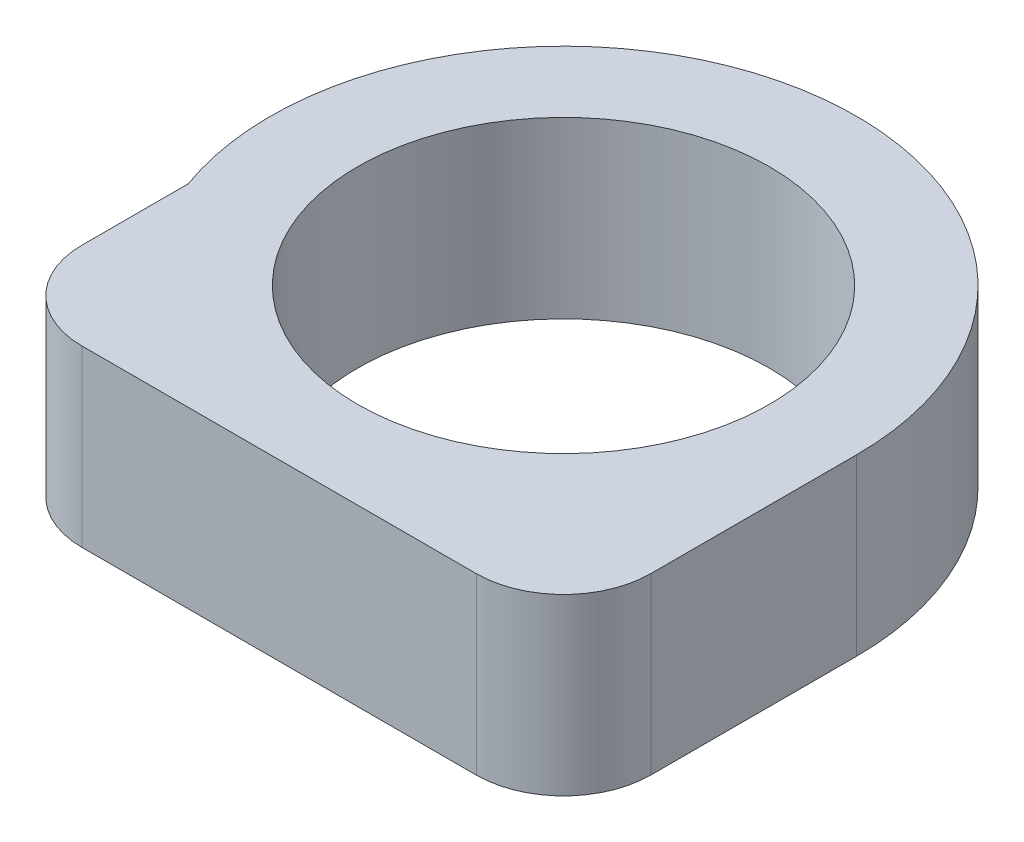
ISO-10303-21;
HEADER;
FILE_DESCRIPTION(('STEP AP214'),'2;1');
FILE_NAME('part.step','',(''),(''),'','','');
FILE_SCHEMA(('AUTOMOTIVE_DESIGN { 1 0 10303 214 1 1 1 1 }'));
ENDSEC;
DATA;
#1=APPLICATION_CONTEXT('core data for automotive mechanical design processes');
#2=APPLICATION_PROTOCOL_DEFINITION('international standard','automotive_design',2000,#1);
#3=PRODUCT_CONTEXT('',#1,'mechanical');
#4=PRODUCT('Part','Part','',(#3));
#5=PRODUCT_RELATED_PRODUCT_CATEGORY('part','',(#4));
#6=PRODUCT_DEFINITION_FORMATION('','',#4);
#7=PRODUCT_DEFINITION_CONTEXT('part definition',#1,'design');
#8=PRODUCT_DEFINITION('design','',#6,#7);
#9=PRODUCT_DEFINITION_SHAPE('','',#8);
#10=(LENGTH_UNIT() NAMED_UNIT(*) SI_UNIT(.MILLI.,.METRE.));
#11=(NAMED_UNIT(*) PLANE_ANGLE_UNIT() SI_UNIT($,.RADIAN.));
#12=(NAMED_UNIT(*) SI_UNIT($,.STERADIAN.) SOLID_ANGLE_UNIT());
#13=UNCERTAINTY_MEASURE_WITH_UNIT(LENGTH_MEASURE(1.E-05),#10,'distance_accuracy_value','');
#14=(GEOMETRIC_REPRESENTATION_CONTEXT(3) GLOBAL_UNCERTAINTY_ASSIGNED_CONTEXT((#13)) GLOBAL_UNIT_ASSIGNED_CONTEXT((#10,
#11,#12)) REPRESENTATION_CONTEXT('',''));
#15=CARTESIAN_POINT('',(0.,0.,0.));
#16=DIRECTION('',(0.,0.,1.));
#17=DIRECTION('',(1.,0.,0.));
#18=AXIS2_PLACEMENT_3D('',#15,#16,#17);
#19=CARTESIAN_POINT('',(-2.71253870759835,10.,-1.61598050665433));
#20=DIRECTION('',(0.,-1.,0.));
#21=DIRECTION('',(0.,0.,-1.));
#22=AXIS2_PLACEMENT_3D('',#19,#20,#21);
#23=CYLINDRICAL_SURFACE('',#22,16.8);
#24=CARTESIAN_POINT('',(-2.71253870759835,0.,-1.61598050665433));
#25=DIRECTION('',(0.,1.,0.));
#26=DIRECTION('',(0.,0.,1.));
#27=AXIS2_PLACEMENT_3D('',#24,#25,#26);
#28=CIRCLE('',#27,16.8);
#29=CARTESIAN_POINT('',(14.0874612924017,0.,-1.61598050665433));
#30=VERTEX_POINT('',#29);
#31=CARTESIAN_POINT('',(-18.5125387075984,0.,4.09366046279375));
#32=VERTEX_POINT('',#31);
#33=EDGE_CURVE('E109',#30,#32,#28,.T.);
#34=ORIENTED_EDGE('',*,*,#33,.T.);
#35=DIRECTION('',(0.,-1.,0.));
#36=VECTOR('',#35,1.);
#37=CARTESIAN_POINT('',(-18.5125387075984,10.,4.09366046279375));
#38=LINE('',#37,#36);
#39=CARTESIAN_POINT('',(-18.5125387075984,10.,4.09366046279375));
#40=VERTEX_POINT('',#39);
#41=EDGE_CURVE('E95',#40,#32,#38,.T.);
#42=ORIENTED_EDGE('',*,*,#41,.F.);
#43=CARTESIAN_POINT('',(-2.71253870759835,10.,-1.61598050665433));
#44=DIRECTION('',(0.,1.,0.));
#45=DIRECTION('',(0.,0.,1.));
#46=AXIS2_PLACEMENT_3D('',#43,#44,#45);
#47=CIRCLE('',#46,16.8);
#48=CARTESIAN_POINT('',(14.0874612924017,10.,-1.61598050665433));
#49=VERTEX_POINT('',#48);
#50=EDGE_CURVE('E99',#49,#40,#47,.T.);
#51=ORIENTED_EDGE('',*,*,#50,.F.);
#52=DIRECTION('',(0.,-1.,0.));
#53=VECTOR('',#52,1.);
#54=CARTESIAN_POINT('',(14.0874612924017,10.,-1.61598050665433));
#55=LINE('',#54,#53);
#56=EDGE_CURVE('E111',#49,#30,#55,.T.);
#57=ORIENTED_EDGE('',*,*,#56,.T.);
#58=EDGE_LOOP('',(#34,#42,#51,#57));
#59=FACE_BOUND('',#58,.T.);
#60=ADVANCED_FACE('F37',(#59),#23,.T.);
#61=CARTESIAN_POINT('',(-18.5125387075984,10.,0.));
#62=DIRECTION('',(1.,0.,0.));
#63=DIRECTION('',(0.,0.,-1.));
#64=AXIS2_PLACEMENT_3D('',#61,#62,#63);
#65=PLANE('',#64);
#66=DIRECTION('',(0.,0.,1.));
#67=VECTOR('',#66,1.);
#68=CARTESIAN_POINT('',(-18.5125387075984,0.,0.));
#69=LINE('',#68,#67);
#70=CARTESIAN_POINT('',(-18.5125387075983,0.,10.1840194933457));
#71=VERTEX_POINT('',#70);
#72=EDGE_CURVE('E139',#32,#71,#69,.T.);
#73=ORIENTED_EDGE('',*,*,#72,.T.);
#74=DIRECTION('',(0.,-1.,0.));
#75=VECTOR('',#74,1.);
#76=CARTESIAN_POINT('',(-18.5125387075983,10.,10.1840194933457));
#77=LINE('',#76,#75);
#78=CARTESIAN_POINT('',(-18.5125387075983,10.,10.1840194933457));
#79=VERTEX_POINT('',#78);
#80=EDGE_CURVE('E60',#71,#79,#77,.F.);
#81=ORIENTED_EDGE('',*,*,#80,.T.);
#82=DIRECTION('',(0.,0.,1.));
#83=VECTOR('',#82,1.);
#84=CARTESIAN_POINT('',(-18.5125387075984,10.,0.));
#85=LINE('',#84,#83);
#86=EDGE_CURVE('E91',#40,#79,#85,.T.);
#87=ORIENTED_EDGE('',*,*,#86,.F.);
#88=ORIENTED_EDGE('',*,*,#41,.T.);
#89=EDGE_LOOP('',(#73,#81,#87,#88));
#90=FACE_BOUND('',#89,.T.);
#91=ADVANCED_FACE('F93',(#90),#65,.F.);
#92=CARTESIAN_POINT('',(0.,10.,15.1840194933457));
#93=DIRECTION('',(0.,0.,-1.));
#94=DIRECTION('',(-1.,0.,0.));
#95=AXIS2_PLACEMENT_3D('',#92,#93,#94);
#96=PLANE('',#95);
#97=DIRECTION('',(1.,0.,0.));
#98=VECTOR('',#97,1.);
#99=CARTESIAN_POINT('',(0.,10.,15.1840194933457));
#100=LINE('',#99,#98);
#101=CARTESIAN_POINT('',(-13.5125387075984,10.,15.1840194933457));
#102=VERTEX_POINT('',#101);
#103=CARTESIAN_POINT('',(9.08746129240165,10.,15.1840194933457));
#104=VERTEX_POINT('',#103);
#105=EDGE_CURVE('E98',#102,#104,#100,.T.);
#106=ORIENTED_EDGE('',*,*,#105,.F.);
#107=DIRECTION('',(0.,-1.,0.));
#108=VECTOR('',#107,1.);
#109=CARTESIAN_POINT('',(-13.5125387075984,10.,15.1840194933457));
#110=LINE('',#109,#108);
#111=CARTESIAN_POINT('',(-13.5125387075984,0.,15.1840194933457));
#112=VERTEX_POINT('',#111);
#113=EDGE_CURVE('E113',#102,#112,#110,.T.);
#114=ORIENTED_EDGE('',*,*,#113,.T.);
#115=DIRECTION('',(1.,0.,0.));
#116=VECTOR('',#115,1.);
#117=CARTESIAN_POINT('',(0.,0.,15.1840194933457));
#118=LINE('',#117,#116);
#119=CARTESIAN_POINT('',(9.08746129240165,0.,15.1840194933457));
#120=VERTEX_POINT('',#119);
#121=EDGE_CURVE('E140',#112,#120,#118,.T.);
#122=ORIENTED_EDGE('',*,*,#121,.T.);
#123=DIRECTION('',(0.,-1.,0.));
#124=VECTOR('',#123,1.);
#125=CARTESIAN_POINT('',(9.08746129240165,10.,15.1840194933457));
#126=LINE('',#125,#124);
#127=EDGE_CURVE('E110',#120,#104,#126,.F.);
#128=ORIENTED_EDGE('',*,*,#127,.T.);
#129=EDGE_LOOP('',(#106,#114,#122,#128));
#130=FACE_BOUND('',#129,.T.);
#131=ADVANCED_FACE('F130',(#130),#96,.F.);
#132=CARTESIAN_POINT('',(14.0874612924017,10.,0.));
#133=DIRECTION('',(1.,0.,0.));
#134=DIRECTION('',(0.,0.,-1.));
#135=AXIS2_PLACEMENT_3D('',#132,#133,#134);
#136=PLANE('',#135);
#137=DIRECTION('',(0.,0.,1.));
#138=VECTOR('',#137,1.);
#139=CARTESIAN_POINT('',(14.0874612924017,10.,0.));
#140=LINE('',#139,#138);
#141=CARTESIAN_POINT('',(14.0874612924017,10.,10.1840194933457));
#142=VERTEX_POINT('',#141);
#143=EDGE_CURVE('E104',#49,#142,#140,.T.);
#144=ORIENTED_EDGE('',*,*,#143,.T.);
#145=DIRECTION('',(0.,-1.,0.));
#146=VECTOR('',#145,1.);
#147=CARTESIAN_POINT('',(14.0874612924017,0.,10.1840194933457));
#148=LINE('',#147,#146);
#149=CARTESIAN_POINT('',(14.0874612924017,0.,10.1840194933457));
#150=VERTEX_POINT('',#149);
#151=EDGE_CURVE('E11',#142,#150,#148,.T.);
#152=ORIENTED_EDGE('',*,*,#151,.T.);
#153=DIRECTION('',(0.,0.,1.));
#154=VECTOR('',#153,1.);
#155=CARTESIAN_POINT('',(14.0874612924017,0.,0.));
#156=LINE('',#155,#154);
#157=EDGE_CURVE('E142',#30,#150,#156,.T.);
#158=ORIENTED_EDGE('',*,*,#157,.F.);
#159=ORIENTED_EDGE('',*,*,#56,.F.);
#160=EDGE_LOOP('',(#144,#152,#158,#159));
#161=FACE_BOUND('',#160,.T.);
#162=ADVANCED_FACE('F153',(#161),#136,.T.);
#163=CARTESIAN_POINT('',(-2.71253870759835,10.,-1.61598050665433));
#164=DIRECTION('',(0.,-1.,0.));
#165=DIRECTION('',(0.,0.,-1.));
#166=AXIS2_PLACEMENT_3D('',#163,#164,#165);
#167=CYLINDRICAL_SURFACE('',#166,11.8);
#168=CARTESIAN_POINT('',(-2.71253870759835,10.,-1.61598050665433));
#169=DIRECTION('',(0.,1.,0.));
#170=DIRECTION('',(0.,0.,1.));
#171=AXIS2_PLACEMENT_3D('',#168,#169,#170);
#172=CIRCLE('',#171,11.8);
#173=CARTESIAN_POINT('',(-2.71253870759835,10.,10.1840194933457));
#174=VERTEX_POINT('',#173);
#175=EDGE_CURVE('E115',#174,#174,#172,.T.);
#176=ORIENTED_EDGE('',*,*,#175,.T.);
#177=EDGE_LOOP('',(#176));
#178=FACE_BOUND('',#177,.T.);
#179=CARTESIAN_POINT('',(-2.71253870759835,0.,-1.61598050665433));
#180=DIRECTION('',(0.,1.,0.));
#181=DIRECTION('',(0.,0.,1.));
#182=AXIS2_PLACEMENT_3D('',#179,#180,#181);
#183=CIRCLE('',#182,11.8);
#184=CARTESIAN_POINT('',(-2.71253870759835,0.,10.1840194933457));
#185=VERTEX_POINT('',#184);
#186=EDGE_CURVE('E106',#185,#185,#183,.T.);
#187=ORIENTED_EDGE('',*,*,#186,.F.);
#188=EDGE_LOOP('',(#187));
#189=FACE_BOUND('',#188,.T.);
#190=ADVANCED_FACE('F151',(#178,#189),#167,.F.);
#191=CARTESIAN_POINT('',(0.,10.,0.));
#192=DIRECTION('',(0.,1.,0.));
#193=DIRECTION('',(0.,0.,1.));
#194=AXIS2_PLACEMENT_3D('',#191,#192,#193);
#195=PLANE('',#194);
#196=ORIENTED_EDGE('',*,*,#86,.T.);
#197=CARTESIAN_POINT('',(-13.5125387075984,10.,10.1840194933457));
#198=DIRECTION('',(0.,1.,0.));
#199=DIRECTION('',(0.,0.,1.));
#200=AXIS2_PLACEMENT_3D('',#197,#198,#199);
#201=CIRCLE('',#200,5.);
#202=EDGE_CURVE('E45',#79,#102,#201,.T.);
#203=ORIENTED_EDGE('',*,*,#202,.T.);
#204=ORIENTED_EDGE('',*,*,#105,.T.);
#205=CARTESIAN_POINT('',(9.08746129240165,10.,10.1840194933457));
#206=DIRECTION('',(0.,1.,0.));
#207=DIRECTION('',(0.,0.,1.));
#208=AXIS2_PLACEMENT_3D('',#205,#206,#207);
#209=CIRCLE('',#208,5.);
#210=EDGE_CURVE('E52',#104,#142,#209,.T.);
#211=ORIENTED_EDGE('',*,*,#210,.T.);
#212=ORIENTED_EDGE('',*,*,#143,.F.);
#213=ORIENTED_EDGE('',*,*,#50,.T.);
#214=EDGE_LOOP('',(#196,#203,#204,#211,#212,#213));
#215=FACE_BOUND('',#214,.T.);
#216=ORIENTED_EDGE('',*,*,#175,.F.);
#217=EDGE_LOOP('',(#216));
#218=FACE_BOUND('',#217,.T.);
#219=ADVANCED_FACE('F102',(#215,#218),#195,.T.);
#220=CARTESIAN_POINT('',(0.,0.,0.));
#221=DIRECTION('',(0.,1.,0.));
#222=DIRECTION('',(0.,0.,1.));
#223=AXIS2_PLACEMENT_3D('',#220,#221,#222);
#224=PLANE('',#223);
#225=ORIENTED_EDGE('',*,*,#121,.F.);
#226=CARTESIAN_POINT('',(-13.5125387075984,0.,10.1840194933457));
#227=DIRECTION('',(0.,1.,0.));
#228=DIRECTION('',(0.,0.,1.));
#229=AXIS2_PLACEMENT_3D('',#226,#227,#228);
#230=CIRCLE('',#229,5.);
#231=EDGE_CURVE('E123',#112,#71,#230,.F.);
#232=ORIENTED_EDGE('',*,*,#231,.T.);
#233=ORIENTED_EDGE('',*,*,#72,.F.);
#234=ORIENTED_EDGE('',*,*,#33,.F.);
#235=ORIENTED_EDGE('',*,*,#157,.T.);
#236=CARTESIAN_POINT('',(9.08746129240165,0.,10.1840194933457));
#237=DIRECTION('',(0.,1.,0.));
#238=DIRECTION('',(0.,0.,1.));
#239=AXIS2_PLACEMENT_3D('',#236,#237,#238);
#240=CIRCLE('',#239,5.);
#241=EDGE_CURVE('E121',#150,#120,#240,.F.);
#242=ORIENTED_EDGE('',*,*,#241,.T.);
#243=EDGE_LOOP('',(#225,#232,#233,#234,#235,#242));
#244=FACE_BOUND('',#243,.T.);
#245=ORIENTED_EDGE('',*,*,#186,.T.);
#246=EDGE_LOOP('',(#245));
#247=FACE_BOUND('',#246,.T.);
#248=ADVANCED_FACE('F137',(#244,#247),#224,.F.);
#249=CARTESIAN_POINT('',(-13.5125387075984,10.,10.1840194933457));
#250=DIRECTION('',(0.,-1.,0.));
#251=DIRECTION('',(0.,0.,-1.));
#252=AXIS2_PLACEMENT_3D('',#249,#250,#251);
#253=CYLINDRICAL_SURFACE('',#252,5.);
#254=ORIENTED_EDGE('',*,*,#202,.F.);
#255=ORIENTED_EDGE('',*,*,#80,.F.);
#256=ORIENTED_EDGE('',*,*,#231,.F.);
#257=ORIENTED_EDGE('',*,*,#113,.F.);
#258=EDGE_LOOP('',(#254,#255,#256,#257));
#259=FACE_BOUND('',#258,.T.);
#260=ADVANCED_FACE('F135',(#259),#253,.T.);
#261=CARTESIAN_POINT('',(9.08746129240165,10.,10.1840194933457));
#262=DIRECTION('',(0.,1.,0.));
#263=DIRECTION('',(0.,0.,1.));
#264=AXIS2_PLACEMENT_3D('',#261,#262,#263);
#265=CYLINDRICAL_SURFACE('',#264,5.);
#266=ORIENTED_EDGE('',*,*,#210,.F.);
#267=ORIENTED_EDGE('',*,*,#127,.F.);
#268=ORIENTED_EDGE('',*,*,#241,.F.);
#269=ORIENTED_EDGE('',*,*,#151,.F.);
#270=EDGE_LOOP('',(#266,#267,#268,#269));
#271=FACE_BOUND('',#270,.T.);
#272=ADVANCED_FACE('F39',(#271),#265,.T.);
#273=CLOSED_SHELL('',(#60,#91,#131,#162,#190,#219,#248,#260,#272));
#274=MANIFOLD_SOLID_BREP('B2',#273);
#275=ADVANCED_BREP_SHAPE_REPRESENTATION('',(#18,#274),#14);
#276=SHAPE_DEFINITION_REPRESENTATION(#9,#275);
ENDSEC;
END-ISO-10303-21;
